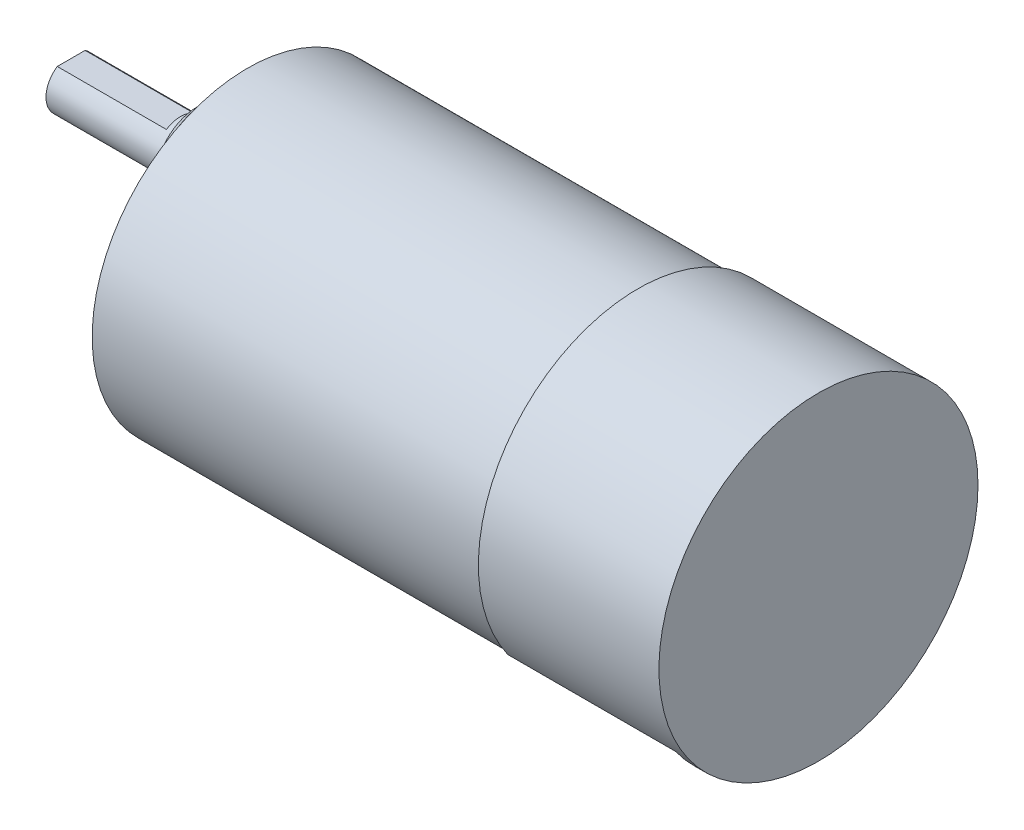
ISO-10303-21;
HEADER;
FILE_DESCRIPTION(('STEP AP214'),'2;1');
FILE_NAME('part.step','',(''),(''),'','','');
FILE_SCHEMA(('AUTOMOTIVE_DESIGN { 1 0 10303 214 1 1 1 1 }'));
ENDSEC;
DATA;
#1=APPLICATION_CONTEXT('core data for automotive mechanical design processes');
#2=APPLICATION_PROTOCOL_DEFINITION('international standard','automotive_design',2000,#1);
#3=PRODUCT_CONTEXT('',#1,'mechanical');
#4=PRODUCT('Part','Part','',(#3));
#5=PRODUCT_RELATED_PRODUCT_CATEGORY('part','',(#4));
#6=PRODUCT_DEFINITION_FORMATION('','',#4);
#7=PRODUCT_DEFINITION_CONTEXT('part definition',#1,'design');
#8=PRODUCT_DEFINITION('design','',#6,#7);
#9=PRODUCT_DEFINITION_SHAPE('','',#8);
#10=(LENGTH_UNIT() NAMED_UNIT(*) SI_UNIT(.MILLI.,.METRE.));
#11=(NAMED_UNIT(*) PLANE_ANGLE_UNIT() SI_UNIT($,.RADIAN.));
#12=(NAMED_UNIT(*) SI_UNIT($,.STERADIAN.) SOLID_ANGLE_UNIT());
#13=UNCERTAINTY_MEASURE_WITH_UNIT(LENGTH_MEASURE(1.E-05),#10,'distance_accuracy_value','');
#14=(GEOMETRIC_REPRESENTATION_CONTEXT(3) GLOBAL_UNCERTAINTY_ASSIGNED_CONTEXT((#13)) GLOBAL_UNIT_ASSIGNED_CONTEXT((#10,
#11,#12)) REPRESENTATION_CONTEXT('',''));
#15=CARTESIAN_POINT('',(0.,0.,0.));
#16=DIRECTION('',(0.,0.,1.));
#17=DIRECTION('',(1.,0.,0.));
#18=AXIS2_PLACEMENT_3D('',#15,#16,#17);
#19=CARTESIAN_POINT('',(68.,0.,0.));
#20=DIRECTION('',(-1.,0.,0.));
#21=DIRECTION('',(0.,0.,1.));
#22=AXIS2_PLACEMENT_3D('',#19,#20,#21);
#23=CYLINDRICAL_SURFACE('',#22,19.);
#24=CARTESIAN_POINT('',(68.,0.,0.));
#25=DIRECTION('',(1.,0.,0.));
#26=DIRECTION('',(0.,0.,-1.));
#27=AXIS2_PLACEMENT_3D('',#24,#25,#26);
#28=CIRCLE('',#27,19.);
#29=CARTESIAN_POINT('',(68.,0.,-19.));
#30=VERTEX_POINT('',#29);
#31=EDGE_CURVE('E102',#30,#30,#28,.T.);
#32=ORIENTED_EDGE('',*,*,#31,.F.);
#33=EDGE_LOOP('',(#32));
#34=FACE_BOUND('',#33,.T.);
#35=DIRECTION('',(-1.,0.,0.));
#36=VECTOR('',#35,1.);
#37=CARTESIAN_POINT('',(68.,-10.988630487918,-15.5));
#38=LINE('',#37,#36);
#39=CARTESIAN_POINT('',(46.5,-10.988630487918,-15.5));
#40=VERTEX_POINT('',#39);
#41=CARTESIAN_POINT('',(66.5,-10.988630487918,-15.5));
#42=VERTEX_POINT('',#41);
#43=EDGE_CURVE('E106',#40,#42,#38,.F.);
#44=ORIENTED_EDGE('',*,*,#43,.F.);
#45=CARTESIAN_POINT('',(46.5,0.,0.));
#46=DIRECTION('',(1.,0.,0.));
#47=DIRECTION('',(0.,0.,-1.));
#48=AXIS2_PLACEMENT_3D('',#45,#46,#47);
#49=CIRCLE('',#48,19.);
#50=CARTESIAN_POINT('',(46.5,-10.988630487918,15.5));
#51=VERTEX_POINT('',#50);
#52=EDGE_CURVE('E100',#40,#51,#49,.T.);
#53=ORIENTED_EDGE('',*,*,#52,.T.);
#54=DIRECTION('',(-1.,0.,0.));
#55=VECTOR('',#54,1.);
#56=CARTESIAN_POINT('',(68.,-10.988630487918,15.5));
#57=LINE('',#56,#55);
#58=CARTESIAN_POINT('',(66.5,-10.988630487918,15.5));
#59=VERTEX_POINT('',#58);
#60=EDGE_CURVE('E110',#51,#59,#57,.F.);
#61=ORIENTED_EDGE('',*,*,#60,.T.);
#62=CARTESIAN_POINT('',(66.5,0.,0.));
#63=DIRECTION('',(1.,0.,0.));
#64=DIRECTION('',(0.,0.,-1.));
#65=AXIS2_PLACEMENT_3D('',#62,#63,#64);
#66=CIRCLE('',#65,19.);
#67=EDGE_CURVE('E12',#59,#42,#66,.T.);
#68=ORIENTED_EDGE('',*,*,#67,.T.);
#69=EDGE_LOOP('',(#44,#53,#61,#68));
#70=FACE_BOUND('',#69,.T.);
#71=ADVANCED_FACE('F45',(#34,#70),#23,.T.);
#72=CARTESIAN_POINT('',(46.5,0.,0.));
#73=DIRECTION('',(1.,0.,0.));
#74=DIRECTION('',(0.,0.,-1.));
#75=AXIS2_PLACEMENT_3D('',#72,#73,#74);
#76=PLANE('',#75);
#77=DIRECTION('',(0.,-1.,0.));
#78=VECTOR('',#77,1.);
#79=CARTESIAN_POINT('',(46.5,0.,-15.5));
#80=LINE('',#79,#78);
#81=CARTESIAN_POINT('',(46.5,0.,-15.5));
#82=VERTEX_POINT('',#81);
#83=EDGE_CURVE('E52',#82,#40,#80,.T.);
#84=ORIENTED_EDGE('',*,*,#83,.F.);
#85=DIRECTION('',(0.,0.,-1.));
#86=VECTOR('',#85,1.);
#87=CARTESIAN_POINT('',(46.5,0.,15.5));
#88=LINE('',#87,#86);
#89=CARTESIAN_POINT('',(46.5,0.,15.5));
#90=VERTEX_POINT('',#89);
#91=EDGE_CURVE('E90',#90,#82,#88,.T.);
#92=ORIENTED_EDGE('',*,*,#91,.F.);
#93=DIRECTION('',(0.,-1.,0.));
#94=VECTOR('',#93,1.);
#95=CARTESIAN_POINT('',(46.5,0.,15.5));
#96=LINE('',#95,#94);
#97=EDGE_CURVE('E101',#90,#51,#96,.T.);
#98=ORIENTED_EDGE('',*,*,#97,.T.);
#99=ORIENTED_EDGE('',*,*,#52,.F.);
#100=EDGE_LOOP('',(#84,#92,#98,#99));
#101=FACE_BOUND('',#100,.T.);
#102=ADVANCED_FACE('F98',(#101),#76,.F.);
#103=CARTESIAN_POINT('',(68.,0.,0.));
#104=DIRECTION('',(1.,0.,0.));
#105=DIRECTION('',(0.,0.,-1.));
#106=AXIS2_PLACEMENT_3D('',#103,#104,#105);
#107=PLANE('',#106);
#108=ORIENTED_EDGE('',*,*,#31,.T.);
#109=EDGE_LOOP('',(#108));
#110=FACE_BOUND('',#109,.T.);
#111=ADVANCED_FACE('F128',(#110),#107,.T.);
#112=CARTESIAN_POINT('',(66.5,-21.5,15.5));
#113=DIRECTION('',(1.,0.,0.));
#114=DIRECTION('',(0.,0.,-1.));
#115=AXIS2_PLACEMENT_3D('',#112,#113,#114);
#116=PLANE('',#115);
#117=DIRECTION('',(0.,1.,0.));
#118=VECTOR('',#117,1.);
#119=CARTESIAN_POINT('',(66.5,-21.5,15.5));
#120=LINE('',#119,#118);
#121=CARTESIAN_POINT('',(66.5,0.,15.5));
#122=VERTEX_POINT('',#121);
#123=EDGE_CURVE('E114',#59,#122,#120,.T.);
#124=ORIENTED_EDGE('',*,*,#123,.T.);
#125=DIRECTION('',(0.,0.,-1.));
#126=VECTOR('',#125,1.);
#127=CARTESIAN_POINT('',(66.5,0.,15.5));
#128=LINE('',#127,#126);
#129=CARTESIAN_POINT('',(66.5,0.,-15.5));
#130=VERTEX_POINT('',#129);
#131=EDGE_CURVE('E89',#122,#130,#128,.T.);
#132=ORIENTED_EDGE('',*,*,#131,.T.);
#133=DIRECTION('',(0.,1.,0.));
#134=VECTOR('',#133,1.);
#135=CARTESIAN_POINT('',(66.5,-21.5,-15.5));
#136=LINE('',#135,#134);
#137=EDGE_CURVE('E87',#42,#130,#136,.T.);
#138=ORIENTED_EDGE('',*,*,#137,.F.);
#139=ORIENTED_EDGE('',*,*,#67,.F.);
#140=EDGE_LOOP('',(#124,#132,#138,#139));
#141=FACE_BOUND('',#140,.T.);
#142=ADVANCED_FACE('F118',(#141),#116,.F.);
#143=CARTESIAN_POINT('',(46.5,-21.5,-15.5));
#144=DIRECTION('',(0.,0.,1.));
#145=DIRECTION('',(1.,0.,0.));
#146=AXIS2_PLACEMENT_3D('',#143,#144,#145);
#147=PLANE('',#146);
#148=ORIENTED_EDGE('',*,*,#43,.T.);
#149=ORIENTED_EDGE('',*,*,#137,.T.);
#150=DIRECTION('',(1.,0.,0.));
#151=VECTOR('',#150,1.);
#152=CARTESIAN_POINT('',(46.5,0.,-15.5));
#153=LINE('',#152,#151);
#154=EDGE_CURVE('E84',#82,#130,#153,.T.);
#155=ORIENTED_EDGE('',*,*,#154,.F.);
#156=ORIENTED_EDGE('',*,*,#83,.T.);
#157=EDGE_LOOP('',(#148,#149,#155,#156));
#158=FACE_BOUND('',#157,.T.);
#159=ADVANCED_FACE('F85',(#158),#147,.T.);
#160=CARTESIAN_POINT('',(46.5,-21.5,15.5));
#161=DIRECTION('',(0.,0.,1.));
#162=DIRECTION('',(1.,0.,0.));
#163=AXIS2_PLACEMENT_3D('',#160,#161,#162);
#164=PLANE('',#163);
#165=ORIENTED_EDGE('',*,*,#97,.F.);
#166=DIRECTION('',(1.,0.,0.));
#167=VECTOR('',#166,1.);
#168=CARTESIAN_POINT('',(46.5,0.,15.5));
#169=LINE('',#168,#167);
#170=EDGE_CURVE('E59',#90,#122,#169,.T.);
#171=ORIENTED_EDGE('',*,*,#170,.T.);
#172=ORIENTED_EDGE('',*,*,#123,.F.);
#173=ORIENTED_EDGE('',*,*,#60,.F.);
#174=EDGE_LOOP('',(#165,#171,#172,#173));
#175=FACE_BOUND('',#174,.T.);
#176=ADVANCED_FACE('F121',(#175),#164,.F.);
#177=CARTESIAN_POINT('',(0.,0.,0.));
#178=DIRECTION('',(0.,-1.,0.));
#179=DIRECTION('',(0.,0.,-1.));
#180=AXIS2_PLACEMENT_3D('',#177,#178,#179);
#181=PLANE('',#180);
#182=ORIENTED_EDGE('',*,*,#91,.T.);
#183=ORIENTED_EDGE('',*,*,#154,.T.);
#184=ORIENTED_EDGE('',*,*,#131,.F.);
#185=ORIENTED_EDGE('',*,*,#170,.F.);
#186=EDGE_LOOP('',(#182,#183,#184,#185));
#187=FACE_BOUND('',#186,.T.);
#188=ADVANCED_FACE('F93',(#187),#181,.T.);
#189=CLOSED_SHELL('',(#71,#102,#111,#142,#159,#176,#188));
#190=MANIFOLD_SOLID_BREP('B2',#189);
#191=CARTESIAN_POINT('',(-21.,6.5,0.));
#192=DIRECTION('',(1.,0.,0.));
#193=DIRECTION('',(0.,0.,-1.));
#194=AXIS2_PLACEMENT_3D('',#191,#192,#193);
#195=CYLINDRICAL_SURFACE('',#194,3.);
#196=CARTESIAN_POINT('',(-21.,6.5,0.));
#197=DIRECTION('',(-1.,0.,0.));
#198=DIRECTION('',(0.,0.,1.));
#199=AXIS2_PLACEMENT_3D('',#196,#197,#198);
#200=CIRCLE('',#199,3.);
#201=CARTESIAN_POINT('',(-21.,9.,-1.6583123951777));
#202=VERTEX_POINT('',#201);
#203=CARTESIAN_POINT('',(-21.,9.,1.6583123951777));
#204=VERTEX_POINT('',#203);
#205=EDGE_CURVE('E43',#202,#204,#200,.T.);
#206=ORIENTED_EDGE('',*,*,#205,.F.);
#207=DIRECTION('',(-1.,0.,0.));
#208=VECTOR('',#207,1.);
#209=CARTESIAN_POINT('',(-8.,9.,-1.6583123951777));
#210=LINE('',#209,#208);
#211=CARTESIAN_POINT('',(-8.,9.,-1.6583123951777));
#212=VERTEX_POINT('',#211);
#213=EDGE_CURVE('E205',#212,#202,#210,.T.);
#214=ORIENTED_EDGE('',*,*,#213,.F.);
#215=CARTESIAN_POINT('',(-8.,6.5,0.));
#216=DIRECTION('',(-1.,0.,0.));
#217=DIRECTION('',(0.,0.,1.));
#218=AXIS2_PLACEMENT_3D('',#215,#216,#217);
#219=CIRCLE('',#218,3.);
#220=CARTESIAN_POINT('',(-8.,9.,1.6583123951777));
#221=VERTEX_POINT('',#220);
#222=EDGE_CURVE('E220',#221,#212,#219,.T.);
#223=ORIENTED_EDGE('',*,*,#222,.F.);
#224=DIRECTION('',(-1.,0.,0.));
#225=VECTOR('',#224,1.);
#226=CARTESIAN_POINT('',(-8.,9.,1.6583123951777));
#227=LINE('',#226,#225);
#228=EDGE_CURVE('E211',#221,#204,#227,.T.);
#229=ORIENTED_EDGE('',*,*,#228,.T.);
#230=EDGE_LOOP('',(#206,#214,#223,#229));
#231=FACE_BOUND('',#230,.T.);
#232=CARTESIAN_POINT('',(-6.,6.5,0.));
#233=DIRECTION('',(-1.,0.,0.));
#234=DIRECTION('',(0.,0.,1.));
#235=AXIS2_PLACEMENT_3D('',#232,#233,#234);
#236=CIRCLE('',#235,3.);
#237=CARTESIAN_POINT('',(-6.,6.5,3.));
#238=VERTEX_POINT('',#237);
#239=EDGE_CURVE('E194',#238,#238,#236,.T.);
#240=ORIENTED_EDGE('',*,*,#239,.T.);
#241=EDGE_LOOP('',(#240));
#242=FACE_BOUND('',#241,.T.);
#243=ADVANCED_FACE('F191',(#231,#242),#195,.T.);
#244=CARTESIAN_POINT('',(-21.,6.5,0.));
#245=DIRECTION('',(-1.,0.,0.));
#246=DIRECTION('',(0.,0.,1.));
#247=AXIS2_PLACEMENT_3D('',#244,#245,#246);
#248=PLANE('',#247);
#249=DIRECTION('',(0.,0.,1.));
#250=VECTOR('',#249,1.);
#251=CARTESIAN_POINT('',(-21.,9.,1.6583123951777));
#252=LINE('',#251,#250);
#253=EDGE_CURVE('E216',#202,#204,#252,.T.);
#254=ORIENTED_EDGE('',*,*,#253,.F.);
#255=ORIENTED_EDGE('',*,*,#205,.T.);
#256=EDGE_LOOP('',(#254,#255));
#257=FACE_BOUND('',#256,.T.);
#258=ADVANCED_FACE('F226',(#257),#248,.T.);
#259=CARTESIAN_POINT('',(-6.,6.5,0.));
#260=DIRECTION('',(-1.,0.,0.));
#261=DIRECTION('',(0.,0.,1.));
#262=AXIS2_PLACEMENT_3D('',#259,#260,#261);
#263=PLANE('',#262);
#264=ORIENTED_EDGE('',*,*,#239,.F.);
#265=EDGE_LOOP('',(#264));
#266=FACE_BOUND('',#265,.T.);
#267=ADVANCED_FACE('F228',(#266),#263,.F.);
#268=CARTESIAN_POINT('',(-8.,9.,1.6583123951777));
#269=DIRECTION('',(0.,-1.,0.));
#270=DIRECTION('',(0.,0.,-1.));
#271=AXIS2_PLACEMENT_3D('',#268,#269,#270);
#272=PLANE('',#271);
#273=ORIENTED_EDGE('',*,*,#253,.T.);
#274=ORIENTED_EDGE('',*,*,#228,.F.);
#275=DIRECTION('',(0.,0.,1.));
#276=VECTOR('',#275,1.);
#277=CARTESIAN_POINT('',(-8.,9.,1.6583123951777));
#278=LINE('',#277,#276);
#279=EDGE_CURVE('E243',#212,#221,#278,.T.);
#280=ORIENTED_EDGE('',*,*,#279,.F.);
#281=ORIENTED_EDGE('',*,*,#213,.T.);
#282=EDGE_LOOP('',(#273,#274,#280,#281));
#283=FACE_BOUND('',#282,.T.);
#284=ADVANCED_FACE('F217',(#283),#272,.F.);
#285=CARTESIAN_POINT('',(-8.,6.5,0.));
#286=DIRECTION('',(-1.,0.,0.));
#287=DIRECTION('',(0.,0.,1.));
#288=AXIS2_PLACEMENT_3D('',#285,#286,#287);
#289=PLANE('',#288);
#290=ORIENTED_EDGE('',*,*,#222,.T.);
#291=ORIENTED_EDGE('',*,*,#279,.T.);
#292=EDGE_LOOP('',(#290,#291));
#293=FACE_BOUND('',#292,.T.);
#294=ADVANCED_FACE('F238',(#293),#289,.T.);
#295=CLOSED_SHELL('',(#243,#258,#267,#284,#294));
#296=MANIFOLD_SOLID_BREP('B6',#295);
#297=CARTESIAN_POINT('',(-6.,6.5,0.));
#298=DIRECTION('',(1.,0.,0.));
#299=DIRECTION('',(0.,0.,-1.));
#300=AXIS2_PLACEMENT_3D('',#297,#298,#299);
#301=CYLINDRICAL_SURFACE('',#300,6.);
#302=CARTESIAN_POINT('',(-5.,6.5,0.));
#303=DIRECTION('',(-1.,0.,0.));
#304=DIRECTION('',(0.,0.,1.));
#305=AXIS2_PLACEMENT_3D('',#302,#303,#304);
#306=CIRCLE('',#305,6.);
#307=CARTESIAN_POINT('',(-5.,6.5,6.));
#308=VERTEX_POINT('',#307);
#309=EDGE_CURVE('E190',#308,#308,#306,.F.);
#310=ORIENTED_EDGE('',*,*,#309,.T.);
#311=EDGE_LOOP('',(#310));
#312=FACE_BOUND('',#311,.T.);
#313=CARTESIAN_POINT('',(0.,6.5,0.));
#314=DIRECTION('',(-1.,0.,0.));
#315=DIRECTION('',(0.,0.,1.));
#316=AXIS2_PLACEMENT_3D('',#313,#314,#315);
#317=CIRCLE('',#316,6.);
#318=CARTESIAN_POINT('',(0.,6.5,6.));
#319=VERTEX_POINT('',#318);
#320=EDGE_CURVE('E297',#319,#319,#317,.T.);
#321=ORIENTED_EDGE('',*,*,#320,.T.);
#322=EDGE_LOOP('',(#321));
#323=FACE_BOUND('',#322,.T.);
#324=ADVANCED_FACE('F286',(#312,#323),#301,.T.);
#325=CARTESIAN_POINT('',(-6.,6.5,0.));
#326=DIRECTION('',(-1.,0.,0.));
#327=DIRECTION('',(0.,0.,1.));
#328=AXIS2_PLACEMENT_3D('',#325,#326,#327);
#329=PLANE('',#328);
#330=CARTESIAN_POINT('',(-6.,6.5,0.));
#331=DIRECTION('',(-1.,0.,0.));
#332=DIRECTION('',(0.,0.,1.));
#333=AXIS2_PLACEMENT_3D('',#330,#331,#332);
#334=CIRCLE('',#333,5.);
#335=CARTESIAN_POINT('',(-6.,6.5,5.));
#336=VERTEX_POINT('',#335);
#337=EDGE_CURVE('E293',#336,#336,#334,.T.);
#338=ORIENTED_EDGE('',*,*,#337,.T.);
#339=EDGE_LOOP('',(#338));
#340=FACE_BOUND('',#339,.T.);
#341=ADVANCED_FACE('F307',(#340),#329,.T.);
#342=CARTESIAN_POINT('',(0.,6.5,0.));
#343=DIRECTION('',(-1.,0.,0.));
#344=DIRECTION('',(0.,0.,1.));
#345=AXIS2_PLACEMENT_3D('',#342,#343,#344);
#346=PLANE('',#345);
#347=ORIENTED_EDGE('',*,*,#320,.F.);
#348=EDGE_LOOP('',(#347));
#349=FACE_BOUND('',#348,.T.);
#350=ADVANCED_FACE('F305',(#349),#346,.F.);
#351=CARTESIAN_POINT('',(-6.,6.5,0.));
#352=DIRECTION('',(1.,0.,0.));
#353=DIRECTION('',(0.,0.,-1.));
#354=AXIS2_PLACEMENT_3D('',#351,#352,#353);
#355=CONICAL_SURFACE('',#354,5.,0.785398163397448);
#356=ORIENTED_EDGE('',*,*,#309,.F.);
#357=EDGE_LOOP('',(#356));
#358=FACE_BOUND('',#357,.T.);
#359=ORIENTED_EDGE('',*,*,#337,.F.);
#360=EDGE_LOOP('',(#359));
#361=FACE_BOUND('',#360,.T.);
#362=ADVANCED_FACE('F288',(#358,#361),#355,.T.);
#363=CLOSED_SHELL('',(#324,#341,#350,#362));
#364=MANIFOLD_SOLID_BREP('B37',#363);
#365=CARTESIAN_POINT('',(50.,0.,0.));
#366=DIRECTION('',(-1.,0.,0.));
#367=DIRECTION('',(0.,0.,1.));
#368=AXIS2_PLACEMENT_3D('',#365,#366,#367);
#369=CYLINDRICAL_SURFACE('',#368,18.5);
#370=CARTESIAN_POINT('',(0.,0.,0.));
#371=DIRECTION('',(1.,0.,0.));
#372=DIRECTION('',(0.,0.,-1.));
#373=AXIS2_PLACEMENT_3D('',#370,#371,#372);
#374=CIRCLE('',#373,18.5);
#375=CARTESIAN_POINT('',(0.,0.,-18.5));
#376=VERTEX_POINT('',#375);
#377=EDGE_CURVE('E284',#376,#376,#374,.T.);
#378=ORIENTED_EDGE('',*,*,#377,.T.);
#379=EDGE_LOOP('',(#378));
#380=FACE_BOUND('',#379,.T.);
#381=CARTESIAN_POINT('',(46.5,0.,0.));
#382=DIRECTION('',(1.,0.,0.));
#383=DIRECTION('',(0.,0.,-1.));
#384=AXIS2_PLACEMENT_3D('',#381,#382,#383);
#385=CIRCLE('',#384,18.5);
#386=CARTESIAN_POINT('',(46.5,0.,-18.5));
#387=VERTEX_POINT('',#386);
#388=EDGE_CURVE('E381',#387,#387,#385,.T.);
#389=ORIENTED_EDGE('',*,*,#388,.F.);
#390=EDGE_LOOP('',(#389));
#391=FACE_BOUND('',#390,.T.);
#392=ADVANCED_FACE('F341',(#380,#391),#369,.T.);
#393=CARTESIAN_POINT('',(0.,0.,0.));
#394=DIRECTION('',(1.,0.,0.));
#395=DIRECTION('',(0.,0.,-1.));
#396=AXIS2_PLACEMENT_3D('',#393,#394,#395);
#397=PLANE('',#396);
#398=CARTESIAN_POINT('',(0.,6.5,0.));
#399=DIRECTION('',(-1.,0.,0.));
#400=DIRECTION('',(0.,0.,1.));
#401=AXIS2_PLACEMENT_3D('',#398,#399,#400);
#402=CIRCLE('',#401,6.);
#403=CARTESIAN_POINT('',(0.,6.5,6.));
#404=VERTEX_POINT('',#403);
#405=EDGE_CURVE('E371',#404,#404,#402,.T.);
#406=ORIENTED_EDGE('',*,*,#405,.F.);
#407=EDGE_LOOP('',(#406));
#408=FACE_BOUND('',#407,.T.);
#409=CARTESIAN_POINT('',(0.,0.,0.));
#410=DIRECTION('',(-1.,0.,0.));
#411=DIRECTION('',(0.,0.,1.));
#412=AXIS2_PLACEMENT_3D('',#409,#410,#411);
#413=CIRCLE('',#412,12.5);
#414=CARTESIAN_POINT('',(0.,9.03846153846153,-8.63459396947833));
#415=VERTEX_POINT('',#414);
#416=CARTESIAN_POINT('',(0.,9.03846153846154,8.63459396947833));
#417=VERTEX_POINT('',#416);
#418=EDGE_CURVE('E375',#415,#417,#413,.T.);
#419=ORIENTED_EDGE('',*,*,#418,.F.);
#420=CARTESIAN_POINT('',(0.,6.5,0.));
#421=DIRECTION('',(1.,0.,0.));
#422=DIRECTION('',(0.,0.,1.));
#423=AXIS2_PLACEMENT_3D('',#420,#421,#422);
#424=CIRCLE('',#423,9.);
#425=EDGE_CURVE('E355',#417,#415,#424,.T.);
#426=ORIENTED_EDGE('',*,*,#425,.F.);
#427=EDGE_LOOP('',(#419,#426));
#428=FACE_BOUND('',#427,.T.);
#429=ORIENTED_EDGE('',*,*,#377,.F.);
#430=EDGE_LOOP('',(#429));
#431=FACE_BOUND('',#430,.T.);
#432=ADVANCED_FACE('F379',(#408,#428,#431),#397,.F.);
#433=CARTESIAN_POINT('',(0.5,6.5,0.));
#434=DIRECTION('',(-1.,0.,0.));
#435=DIRECTION('',(0.,0.,1.));
#436=AXIS2_PLACEMENT_3D('',#433,#434,#435);
#437=CYLINDRICAL_SURFACE('',#436,9.);
#438=ORIENTED_EDGE('',*,*,#425,.T.);
#439=DIRECTION('',(-1.,0.,0.));
#440=VECTOR('',#439,1.);
#441=CARTESIAN_POINT('',(0.5,9.03846153846153,-8.63459396947833));
#442=LINE('',#441,#440);
#443=CARTESIAN_POINT('',(0.5,9.03846153846153,-8.63459396947833));
#444=VERTEX_POINT('',#443);
#445=EDGE_CURVE('E372',#444,#415,#442,.T.);
#446=ORIENTED_EDGE('',*,*,#445,.F.);
#447=CARTESIAN_POINT('',(0.5,6.5,0.));
#448=DIRECTION('',(1.,0.,0.));
#449=DIRECTION('',(0.,0.,1.));
#450=AXIS2_PLACEMENT_3D('',#447,#448,#449);
#451=CIRCLE('',#450,9.);
#452=CARTESIAN_POINT('',(0.5,9.03846153846154,8.63459396947833));
#453=VERTEX_POINT('',#452);
#454=EDGE_CURVE('E369',#453,#444,#451,.T.);
#455=ORIENTED_EDGE('',*,*,#454,.F.);
#456=DIRECTION('',(-1.,0.,0.));
#457=VECTOR('',#456,1.);
#458=CARTESIAN_POINT('',(0.5,9.03846153846154,8.63459396947833));
#459=LINE('',#458,#457);
#460=EDGE_CURVE('E363',#453,#417,#459,.T.);
#461=ORIENTED_EDGE('',*,*,#460,.T.);
#462=EDGE_LOOP('',(#438,#446,#455,#461));
#463=FACE_BOUND('',#462,.T.);
#464=ADVANCED_FACE('F367',(#463),#437,.T.);
#465=CARTESIAN_POINT('',(0.5,0.,0.));
#466=DIRECTION('',(-1.,0.,0.));
#467=DIRECTION('',(0.,0.,1.));
#468=AXIS2_PLACEMENT_3D('',#465,#466,#467);
#469=CYLINDRICAL_SURFACE('',#468,12.5);
#470=ORIENTED_EDGE('',*,*,#418,.T.);
#471=ORIENTED_EDGE('',*,*,#460,.F.);
#472=CARTESIAN_POINT('',(0.5,0.,0.));
#473=DIRECTION('',(-1.,0.,0.));
#474=DIRECTION('',(0.,0.,1.));
#475=AXIS2_PLACEMENT_3D('',#472,#473,#474);
#476=CIRCLE('',#475,12.5);
#477=EDGE_CURVE('E386',#444,#453,#476,.T.);
#478=ORIENTED_EDGE('',*,*,#477,.F.);
#479=ORIENTED_EDGE('',*,*,#445,.T.);
#480=EDGE_LOOP('',(#470,#471,#478,#479));
#481=FACE_BOUND('',#480,.T.);
#482=ADVANCED_FACE('F376',(#481),#469,.F.);
#483=CARTESIAN_POINT('',(0.5,3.25,0.));
#484=DIRECTION('',(-1.,0.,0.));
#485=DIRECTION('',(0.,0.,1.));
#486=AXIS2_PLACEMENT_3D('',#483,#484,#485);
#487=PLANE('',#486);
#488=ORIENTED_EDGE('',*,*,#454,.T.);
#489=ORIENTED_EDGE('',*,*,#477,.T.);
#490=EDGE_LOOP('',(#488,#489));
#491=FACE_BOUND('',#490,.T.);
#492=ADVANCED_FACE('F400',(#491),#487,.T.);
#493=CARTESIAN_POINT('',(0.5,6.5,0.));
#494=DIRECTION('',(-1.,0.,0.));
#495=DIRECTION('',(0.,0.,1.));
#496=AXIS2_PLACEMENT_3D('',#493,#494,#495);
#497=CYLINDRICAL_SURFACE('',#496,6.);
#498=CARTESIAN_POINT('',(0.5,6.5,0.));
#499=DIRECTION('',(-1.,0.,0.));
#500=DIRECTION('',(0.,0.,1.));
#501=AXIS2_PLACEMENT_3D('',#498,#499,#500);
#502=CIRCLE('',#501,6.);
#503=CARTESIAN_POINT('',(0.5,6.5,6.));
#504=VERTEX_POINT('',#503);
#505=EDGE_CURVE('E348',#504,#504,#502,.T.);
#506=ORIENTED_EDGE('',*,*,#505,.F.);
#507=EDGE_LOOP('',(#506));
#508=FACE_BOUND('',#507,.T.);
#509=ORIENTED_EDGE('',*,*,#405,.T.);
#510=EDGE_LOOP('',(#509));
#511=FACE_BOUND('',#510,.T.);
#512=ADVANCED_FACE('F397',(#508,#511),#497,.F.);
#513=CARTESIAN_POINT('',(0.5,6.5,0.));
#514=DIRECTION('',(-1.,0.,0.));
#515=DIRECTION('',(0.,0.,1.));
#516=AXIS2_PLACEMENT_3D('',#513,#514,#515);
#517=PLANE('',#516);
#518=ORIENTED_EDGE('',*,*,#505,.T.);
#519=EDGE_LOOP('',(#518));
#520=FACE_BOUND('',#519,.T.);
#521=ADVANCED_FACE('F395',(#520),#517,.T.);
#522=CARTESIAN_POINT('',(46.5,0.,0.));
#523=DIRECTION('',(1.,0.,0.));
#524=DIRECTION('',(0.,0.,-1.));
#525=AXIS2_PLACEMENT_3D('',#522,#523,#524);
#526=PLANE('',#525);
#527=ORIENTED_EDGE('',*,*,#388,.T.);
#528=EDGE_LOOP('',(#527));
#529=FACE_BOUND('',#528,.T.);
#530=ADVANCED_FACE('F418',(#529),#526,.T.);
#531=CLOSED_SHELL('',(#392,#432,#464,#482,#492,#512,#521,#530));
#532=MANIFOLD_SOLID_BREP('B185',#531);
#533=ADVANCED_BREP_SHAPE_REPRESENTATION('',(#18,#190,#296,#364,#532),#14);
#534=SHAPE_DEFINITION_REPRESENTATION(#9,#533);
ENDSEC;
END-ISO-10303-21;
